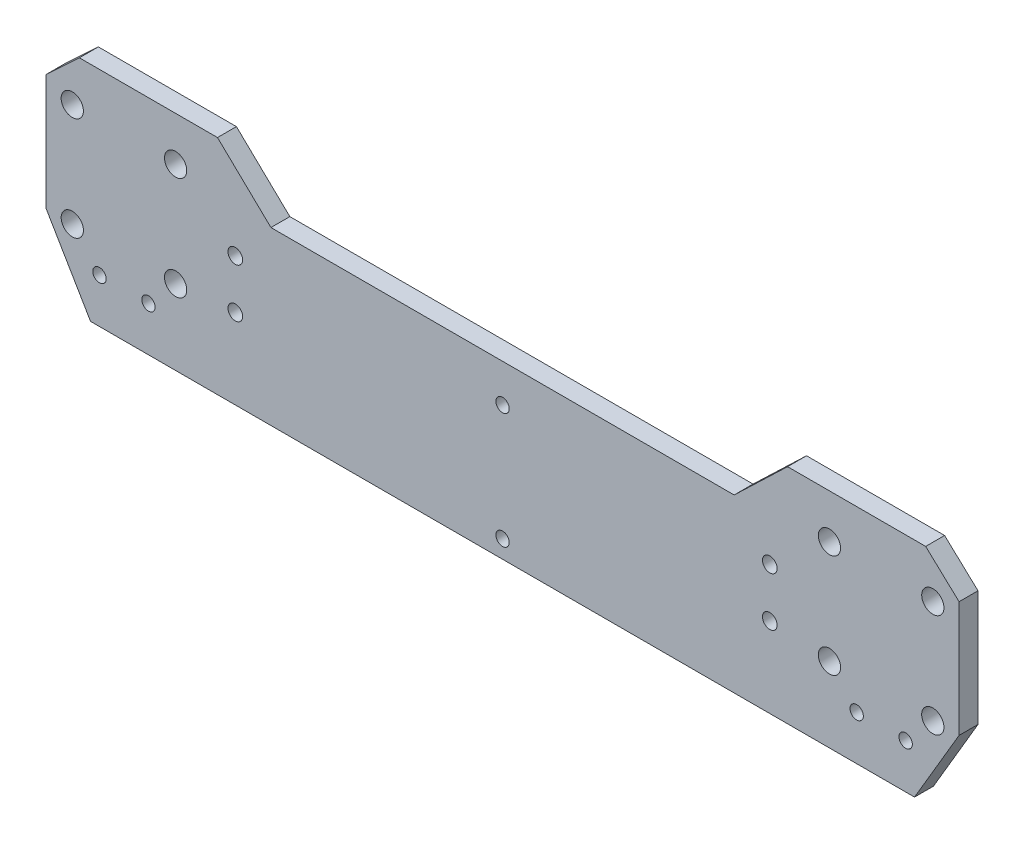
ISO-10303-21;
HEADER;
FILE_DESCRIPTION(('STEP AP214'),'2;1');
FILE_NAME('part.step','',(''),(''),'','','');
FILE_SCHEMA(('AUTOMOTIVE_DESIGN { 1 0 10303 214 1 1 1 1 }'));
ENDSEC;
DATA;
#1=APPLICATION_CONTEXT('core data for automotive mechanical design processes');
#2=APPLICATION_PROTOCOL_DEFINITION('international standard','automotive_design',2000,#1);
#3=PRODUCT_CONTEXT('',#1,'mechanical');
#4=PRODUCT('Part','Part','',(#3));
#5=PRODUCT_RELATED_PRODUCT_CATEGORY('part','',(#4));
#6=PRODUCT_DEFINITION_FORMATION('','',#4);
#7=PRODUCT_DEFINITION_CONTEXT('part definition',#1,'design');
#8=PRODUCT_DEFINITION('design','',#6,#7);
#9=PRODUCT_DEFINITION_SHAPE('','',#8);
#10=(LENGTH_UNIT() NAMED_UNIT(*) SI_UNIT(.MILLI.,.METRE.));
#11=(NAMED_UNIT(*) PLANE_ANGLE_UNIT() SI_UNIT($,.RADIAN.));
#12=(NAMED_UNIT(*) SI_UNIT($,.STERADIAN.) SOLID_ANGLE_UNIT());
#13=UNCERTAINTY_MEASURE_WITH_UNIT(LENGTH_MEASURE(1.E-05),#10,'distance_accuracy_value','');
#14=(GEOMETRIC_REPRESENTATION_CONTEXT(3) GLOBAL_UNCERTAINTY_ASSIGNED_CONTEXT((#13)) GLOBAL_UNIT_ASSIGNED_CONTEXT((#10,
#11,#12)) REPRESENTATION_CONTEXT('',''));
#15=CARTESIAN_POINT('',(0.,0.,0.));
#16=DIRECTION('',(0.,0.,1.));
#17=DIRECTION('',(1.,0.,0.));
#18=AXIS2_PLACEMENT_3D('',#15,#16,#17);
#19=CARTESIAN_POINT('',(0.,0.,4.25));
#20=DIRECTION('',(0.,0.,1.));
#21=DIRECTION('',(1.,0.,0.));
#22=AXIS2_PLACEMENT_3D('',#19,#20,#21);
#23=PLANE('',#22);
#24=CARTESIAN_POINT('',(0.00330952834613573,-20.0074832500386,4.25));
#25=DIRECTION('',(0.,0.,1.));
#26=DIRECTION('',(1.,0.,0.));
#27=AXIS2_PLACEMENT_3D('',#24,#25,#26);
#28=CIRCLE('',#27,1.50001874027195);
#29=CARTESIAN_POINT('',(1.50332826861809,-20.0074832500386,4.25));
#30=VERTEX_POINT('',#29);
#31=EDGE_CURVE('E347',#30,#30,#28,.T.);
#32=ORIENTED_EDGE('',*,*,#31,.F.);
#33=EDGE_LOOP('',(#32));
#34=FACE_BOUND('',#33,.T.);
#35=CARTESIAN_POINT('',(-90.5000193888464,-40.,4.25));
#36=DIRECTION('',(0.,0.,1.));
#37=DIRECTION('',(1.,0.,0.));
#38=AXIS2_PLACEMENT_3D('',#35,#36,#37);
#39=CIRCLE('',#38,1.49997669436749);
#40=CARTESIAN_POINT('',(-89.0000426944789,-40.,4.25));
#41=VERTEX_POINT('',#40);
#42=EDGE_CURVE('E359',#41,#41,#39,.T.);
#43=ORIENTED_EDGE('',*,*,#42,.F.);
#44=EDGE_LOOP('',(#43));
#45=FACE_BOUND('',#44,.T.);
#46=CARTESIAN_POINT('',(-73.3987071931246,-33.1124664238585,4.25));
#47=DIRECTION('',(0.,0.,1.));
#48=DIRECTION('',(1.,0.,0.));
#49=AXIS2_PLACEMENT_3D('',#46,#47,#48);
#50=CIRCLE('',#49,2.49873829135754);
#51=CARTESIAN_POINT('',(-70.8999689017671,-33.1124664238585,4.25));
#52=VERTEX_POINT('',#51);
#53=EDGE_CURVE('E371',#52,#52,#50,.T.);
#54=ORIENTED_EDGE('',*,*,#53,.F.);
#55=EDGE_LOOP('',(#54));
#56=FACE_BOUND('',#55,.T.);
#57=CARTESIAN_POINT('',(-59.99995,-20.9999751749917,4.25));
#58=DIRECTION('',(0.,0.,1.));
#59=DIRECTION('',(1.,0.,0.));
#60=AXIS2_PLACEMENT_3D('',#57,#58,#59);
#61=CIRCLE('',#60,1.65000380400848);
#62=CARTESIAN_POINT('',(-58.3499461959915,-20.9999751749917,4.25));
#63=VERTEX_POINT('',#62);
#64=EDGE_CURVE('E383',#63,#63,#61,.T.);
#65=ORIENTED_EDGE('',*,*,#64,.F.);
#66=EDGE_LOOP('',(#65));
#67=FACE_BOUND('',#66,.T.);
#68=CARTESIAN_POINT('',(60.0066019298635,-31.9998742051955,4.25));
#69=DIRECTION('',(0.,0.,1.));
#70=DIRECTION('',(-1.,0.,0.));
#71=AXIS2_PLACEMENT_3D('',#68,#69,#70);
#72=CIRCLE('',#71,1.64998699004768);
#73=CARTESIAN_POINT('',(58.3566149398158,-31.9998742051955,4.25));
#74=VERTEX_POINT('',#73);
#75=EDGE_CURVE('E395',#74,#74,#72,.T.);
#76=ORIENTED_EDGE('',*,*,#75,.F.);
#77=EDGE_LOOP('',(#76));
#78=FACE_BOUND('',#77,.T.);
#79=CARTESIAN_POINT('',(73.4053621722694,-33.1122652178507,4.25));
#80=DIRECTION('',(0.,0.,1.));
#81=DIRECTION('',(-1.,0.,0.));
#82=AXIS2_PLACEMENT_3D('',#79,#80,#81);
#83=CIRCLE('',#82,2.49873829135753);
#84=CARTESIAN_POINT('',(70.9066238809119,-33.1122652178507,4.25));
#85=VERTEX_POINT('',#84);
#86=EDGE_CURVE('E407',#85,#85,#83,.T.);
#87=ORIENTED_EDGE('',*,*,#86,.F.);
#88=EDGE_LOOP('',(#87));
#89=FACE_BOUND('',#88,.T.);
#90=CARTESIAN_POINT('',(73.4065913502175,-9.89977379053565,4.25));
#91=DIRECTION('',(0.,0.,1.));
#92=DIRECTION('',(-1.,0.,0.));
#93=AXIS2_PLACEMENT_3D('',#90,#91,#92);
#94=CIRCLE('',#93,2.49997137796116);
#95=CARTESIAN_POINT('',(70.9066199722563,-9.89977379053565,4.25));
#96=VERTEX_POINT('',#95);
#97=EDGE_CURVE('E419',#96,#96,#94,.T.);
#98=ORIENTED_EDGE('',*,*,#97,.F.);
#99=EDGE_LOOP('',(#98));
#100=FACE_BOUND('',#99,.T.);
#101=CARTESIAN_POINT('',(96.6037044146789,-33.1130854762066,4.25));
#102=DIRECTION('',(0.,0.,1.));
#103=DIRECTION('',(-1.,0.,0.));
#104=AXIS2_PLACEMENT_3D('',#101,#102,#103);
#105=CIRCLE('',#104,2.49994760386927);
#106=CARTESIAN_POINT('',(94.1037568108097,-33.1130854762066,4.25));
#107=VERTEX_POINT('',#106);
#108=EDGE_CURVE('E431',#107,#107,#105,.T.);
#109=ORIENTED_EDGE('',*,*,#108,.F.);
#110=EDGE_LOOP('',(#109));
#111=FACE_BOUND('',#110,.T.);
#112=CARTESIAN_POINT('',(-96.6000080735269,-9.89999592861705,4.25));
#113=DIRECTION('',(0.,0.,1.));
#114=DIRECTION('',(1.,0.,0.));
#115=AXIS2_PLACEMENT_3D('',#112,#113,#114);
#116=CIRCLE('',#115,2.50000807353394);
#117=CARTESIAN_POINT('',(-94.099999999993,-9.89999592861705,4.25));
#118=VERTEX_POINT('',#117);
#119=EDGE_CURVE('E158',#118,#118,#116,.T.);
#120=ORIENTED_EDGE('',*,*,#119,.F.);
#121=EDGE_LOOP('',(#120));
#122=FACE_BOUND('',#121,.T.);
#123=DIRECTION('',(0.507020126563394,0.861934215157769,0.));
#124=VECTOR('',#123,1.);
#125=CARTESIAN_POINT('',(92.5,-50.,4.25));
#126=LINE('',#125,#124);
#127=CARTESIAN_POINT('',(92.5,-50.,4.25));
#128=VERTEX_POINT('',#127);
#129=CARTESIAN_POINT('',(102.5,-33.,4.25));
#130=VERTEX_POINT('',#129);
#131=EDGE_CURVE('E177',#128,#130,#126,.T.);
#132=ORIENTED_EDGE('',*,*,#131,.T.);
#133=DIRECTION('',(0.,1.,0.));
#134=VECTOR('',#133,1.);
#135=CARTESIAN_POINT('',(102.5,-33.,4.25));
#136=LINE('',#135,#134);
#137=CARTESIAN_POINT('',(102.5,-7.,4.25));
#138=VERTEX_POINT('',#137);
#139=EDGE_CURVE('E105',#130,#138,#136,.T.);
#140=ORIENTED_EDGE('',*,*,#139,.T.);
#141=DIRECTION('',(-0.731055268242869,0.682318250360011,0.));
#142=VECTOR('',#141,1.);
#143=CARTESIAN_POINT('',(102.5,-7.,4.25));
#144=LINE('',#143,#142);
#145=CARTESIAN_POINT('',(95.,0.,4.25));
#146=VERTEX_POINT('',#145);
#147=EDGE_CURVE('E204',#138,#146,#144,.T.);
#148=ORIENTED_EDGE('',*,*,#147,.T.);
#149=DIRECTION('',(-1.,0.,0.));
#150=VECTOR('',#149,1.);
#151=CARTESIAN_POINT('',(95.,0.,4.25));
#152=LINE('',#151,#150);
#153=CARTESIAN_POINT('',(64.,0.,4.25));
#154=VERTEX_POINT('',#153);
#155=EDGE_CURVE('E223',#146,#154,#152,.T.);
#156=ORIENTED_EDGE('',*,*,#155,.T.);
#157=DIRECTION('',(-0.721988205115424,-0.691905363235615,0.));
#158=VECTOR('',#157,1.);
#159=CARTESIAN_POINT('',(64.,0.,4.25));
#160=LINE('',#159,#158);
#161=CARTESIAN_POINT('',(52.,-11.5,4.25));
#162=VERTEX_POINT('',#161);
#163=EDGE_CURVE('E220',#154,#162,#160,.T.);
#164=ORIENTED_EDGE('',*,*,#163,.T.);
#165=DIRECTION('',(-1.,0.,0.));
#166=VECTOR('',#165,1.);
#167=CARTESIAN_POINT('',(52.,-11.5,4.25));
#168=LINE('',#167,#166);
#169=CARTESIAN_POINT('',(-52.,-11.5,4.25));
#170=VERTEX_POINT('',#169);
#171=EDGE_CURVE('E222',#162,#170,#168,.T.);
#172=ORIENTED_EDGE('',*,*,#171,.T.);
#173=DIRECTION('',(-0.721988205115424,0.691905363235615,0.));
#174=VECTOR('',#173,1.);
#175=CARTESIAN_POINT('',(-52.,-11.5,4.25));
#176=LINE('',#175,#174);
#177=CARTESIAN_POINT('',(-64.,0.,4.25));
#178=VERTEX_POINT('',#177);
#179=EDGE_CURVE('E225',#170,#178,#176,.T.);
#180=ORIENTED_EDGE('',*,*,#179,.T.);
#181=DIRECTION('',(-1.,0.,0.));
#182=VECTOR('',#181,1.);
#183=CARTESIAN_POINT('',(-64.,0.,4.25));
#184=LINE('',#183,#182);
#185=CARTESIAN_POINT('',(-95.,0.,4.25));
#186=VERTEX_POINT('',#185);
#187=EDGE_CURVE('E231',#178,#186,#184,.T.);
#188=ORIENTED_EDGE('',*,*,#187,.T.);
#189=DIRECTION('',(-0.731055268242869,-0.682318250360011,0.));
#190=VECTOR('',#189,1.);
#191=CARTESIAN_POINT('',(-95.,0.,4.25));
#192=LINE('',#191,#190);
#193=CARTESIAN_POINT('',(-102.5,-7.,4.25));
#194=VERTEX_POINT('',#193);
#195=EDGE_CURVE('E136',#186,#194,#192,.T.);
#196=ORIENTED_EDGE('',*,*,#195,.T.);
#197=DIRECTION('',(0.,-1.,0.));
#198=VECTOR('',#197,1.);
#199=CARTESIAN_POINT('',(-102.5,-7.,4.25));
#200=LINE('',#199,#198);
#201=CARTESIAN_POINT('',(-102.5,-33.,4.25));
#202=VERTEX_POINT('',#201);
#203=EDGE_CURVE('E130',#194,#202,#200,.T.);
#204=ORIENTED_EDGE('',*,*,#203,.T.);
#205=DIRECTION('',(0.507020126563394,-0.861934215157769,0.));
#206=VECTOR('',#205,1.);
#207=CARTESIAN_POINT('',(-102.5,-33.,4.25));
#208=LINE('',#207,#206);
#209=CARTESIAN_POINT('',(-92.5,-50.,4.25));
#210=VERTEX_POINT('',#209);
#211=EDGE_CURVE('E134',#202,#210,#208,.T.);
#212=ORIENTED_EDGE('',*,*,#211,.T.);
#213=DIRECTION('',(1.,0.,0.));
#214=VECTOR('',#213,1.);
#215=CARTESIAN_POINT('',(-92.5,-50.,4.25));
#216=LINE('',#215,#214);
#217=EDGE_CURVE('E50',#210,#128,#216,.T.);
#218=ORIENTED_EDGE('',*,*,#217,.T.);
#219=EDGE_LOOP('',(#132,#140,#148,#156,#164,#172,#180,#188,#196,#204,#212,#218));
#220=FACE_BOUND('',#219,.T.);
#221=CARTESIAN_POINT('',(96.6065994237146,-9.89973112444412,4.25));
#222=DIRECTION('',(0.,0.,1.));
#223=DIRECTION('',(-1.,0.,0.));
#224=AXIS2_PLACEMENT_3D('',#221,#222,#223);
#225=CIRCLE('',#224,2.50000807353395);
#226=CARTESIAN_POINT('',(94.1065913501806,-9.89973112444412,4.25));
#227=VERTEX_POINT('',#226);
#228=EDGE_CURVE('E437',#227,#227,#225,.T.);
#229=ORIENTED_EDGE('',*,*,#228,.F.);
#230=EDGE_LOOP('',(#229));
#231=FACE_BOUND('',#230,.T.);
#232=CARTESIAN_POINT('',(90.5066932476916,-39.9997519166997,4.25));
#233=DIRECTION('',(0.,0.,1.));
#234=DIRECTION('',(-1.,0.,0.));
#235=AXIS2_PLACEMENT_3D('',#232,#233,#234);
#236=CIRCLE('',#235,1.49997669436749);
#237=CARTESIAN_POINT('',(89.0067165533241,-39.9997519166997,4.25));
#238=VERTEX_POINT('',#237);
#239=EDGE_CURVE('E425',#238,#238,#236,.T.);
#240=ORIENTED_EDGE('',*,*,#239,.F.);
#241=EDGE_LOOP('',(#240));
#242=FACE_BOUND('',#241,.T.);
#243=CARTESIAN_POINT('',(79.5066738588864,-39.9997820694059,4.25));
#244=DIRECTION('',(0.,0.,1.));
#245=DIRECTION('',(-1.,0.,0.));
#246=AXIS2_PLACEMENT_3D('',#243,#244,#245);
#247=CIRCLE('',#246,1.50001782656073);
#248=CARTESIAN_POINT('',(78.0066560323257,-39.9997820694059,4.25));
#249=VERTEX_POINT('',#248);
#250=EDGE_CURVE('E413',#249,#249,#247,.T.);
#251=ORIENTED_EDGE('',*,*,#250,.F.);
#252=EDGE_LOOP('',(#251));
#253=FACE_BOUND('',#252,.T.);
#254=CARTESIAN_POINT('',(60.0065717770364,-20.9998106970364,4.25));
#255=DIRECTION('',(0.,0.,1.));
#256=DIRECTION('',(-1.,0.,0.));
#257=AXIS2_PLACEMENT_3D('',#254,#255,#256);
#258=CIRCLE('',#257,1.65000380400848);
#259=CARTESIAN_POINT('',(58.3565679730279,-20.9998106970364,4.25));
#260=VERTEX_POINT('',#259);
#261=EDGE_CURVE('E401',#260,#260,#258,.T.);
#262=ORIENTED_EDGE('',*,*,#261,.F.);
#263=EDGE_LOOP('',(#262));
#264=FACE_BOUND('',#263,.T.);
#265=CARTESIAN_POINT('',(-73.4,-9.899975,4.25));
#266=DIRECTION('',(0.,0.,1.));
#267=DIRECTION('',(1.,0.,0.));
#268=AXIS2_PLACEMENT_3D('',#265,#266,#267);
#269=CIRCLE('',#268,2.49997137796115);
#270=CARTESIAN_POINT('',(-70.9000286220388,-9.899975,4.25));
#271=VERTEX_POINT('',#270);
#272=EDGE_CURVE('E389',#271,#271,#269,.T.);
#273=ORIENTED_EDGE('',*,*,#272,.F.);
#274=EDGE_LOOP('',(#273));
#275=FACE_BOUND('',#274,.T.);
#276=CARTESIAN_POINT('',(-59.99995,-32.0000386831921,4.25));
#277=DIRECTION('',(0.,0.,1.));
#278=DIRECTION('',(1.,0.,0.));
#279=AXIS2_PLACEMENT_3D('',#276,#277,#278);
#280=CIRCLE('',#279,1.64998699004767);
#281=CARTESIAN_POINT('',(-58.3499630099523,-32.0000386831921,4.25));
#282=VERTEX_POINT('',#281);
#283=EDGE_CURVE('E377',#282,#282,#280,.T.);
#284=ORIENTED_EDGE('',*,*,#283,.F.);
#285=EDGE_LOOP('',(#284));
#286=FACE_BOUND('',#285,.T.);
#287=CARTESIAN_POINT('',(-96.5970494331985,-33.1133502723566,4.25));
#288=DIRECTION('',(0.,0.,1.));
#289=DIRECTION('',(1.,0.,0.));
#290=AXIS2_PLACEMENT_3D('',#287,#288,#289);
#291=CIRCLE('',#290,2.49994760386927);
#292=CARTESIAN_POINT('',(-94.0971018293293,-33.1133502723566,4.25));
#293=VERTEX_POINT('',#292);
#294=EDGE_CURVE('E365',#293,#293,#291,.T.);
#295=ORIENTED_EDGE('',*,*,#294,.F.);
#296=EDGE_LOOP('',(#295));
#297=FACE_BOUND('',#296,.T.);
#298=CARTESIAN_POINT('',(-79.5,-40.,4.25));
#299=DIRECTION('',(0.,0.,1.));
#300=DIRECTION('',(1.,0.,0.));
#301=AXIS2_PLACEMENT_3D('',#298,#299,#300);
#302=CIRCLE('',#301,1.50001782656073);
#303=CARTESIAN_POINT('',(-77.9999821734393,-40.,4.25));
#304=VERTEX_POINT('',#303);
#305=EDGE_CURVE('E353',#304,#304,#302,.T.);
#306=ORIENTED_EDGE('',*,*,#305,.F.);
#307=EDGE_LOOP('',(#306));
#308=FACE_BOUND('',#307,.T.);
#309=CARTESIAN_POINT('',(0.00334516333782881,-46.0075110335172,4.25));
#310=DIRECTION('',(0.,0.,1.));
#311=DIRECTION('',(1.,0.,0.));
#312=AXIS2_PLACEMENT_3D('',#309,#310,#311);
#313=CIRCLE('',#312,1.49998966157518);
#314=CARTESIAN_POINT('',(1.50333482491301,-46.0075110335172,4.25));
#315=VERTEX_POINT('',#314);
#316=EDGE_CURVE('E338',#315,#315,#313,.T.);
#317=ORIENTED_EDGE('',*,*,#316,.F.);
#318=EDGE_LOOP('',(#317));
#319=FACE_BOUND('',#318,.T.);
#320=ADVANCED_FACE('F33',(#34,#45,#56,#67,#78,#89,#100,#111,#122,#220,#231,#242,#253,#264,#275,
#286,#297,#308,#319),#23,.T.);
#321=CARTESIAN_POINT('',(0.,0.,0.));
#322=DIRECTION('',(0.,0.,1.));
#323=DIRECTION('',(1.,0.,0.));
#324=AXIS2_PLACEMENT_3D('',#321,#322,#323);
#325=PLANE('',#324);
#326=DIRECTION('',(0.507020126563394,0.861934215157769,0.));
#327=VECTOR('',#326,1.);
#328=CARTESIAN_POINT('',(92.5,-50.,0.));
#329=LINE('',#328,#327);
#330=CARTESIAN_POINT('',(92.5,-50.,0.));
#331=VERTEX_POINT('',#330);
#332=CARTESIAN_POINT('',(102.5,-33.,0.));
#333=VERTEX_POINT('',#332);
#334=EDGE_CURVE('E154',#331,#333,#329,.T.);
#335=ORIENTED_EDGE('',*,*,#334,.F.);
#336=DIRECTION('',(1.,0.,0.));
#337=VECTOR('',#336,1.);
#338=CARTESIAN_POINT('',(-92.5,-50.,0.));
#339=LINE('',#338,#337);
#340=CARTESIAN_POINT('',(-92.5,-50.,0.));
#341=VERTEX_POINT('',#340);
#342=EDGE_CURVE('E97',#341,#331,#339,.T.);
#343=ORIENTED_EDGE('',*,*,#342,.F.);
#344=DIRECTION('',(0.507020126563394,-0.861934215157769,0.));
#345=VECTOR('',#344,1.);
#346=CARTESIAN_POINT('',(-102.5,-33.,0.));
#347=LINE('',#346,#345);
#348=CARTESIAN_POINT('',(-102.5,-33.,0.));
#349=VERTEX_POINT('',#348);
#350=EDGE_CURVE('E91',#349,#341,#347,.T.);
#351=ORIENTED_EDGE('',*,*,#350,.F.);
#352=DIRECTION('',(0.,-1.,0.));
#353=VECTOR('',#352,1.);
#354=CARTESIAN_POINT('',(-102.5,-7.,0.));
#355=LINE('',#354,#353);
#356=CARTESIAN_POINT('',(-102.5,-7.,0.));
#357=VERTEX_POINT('',#356);
#358=EDGE_CURVE('E144',#357,#349,#355,.T.);
#359=ORIENTED_EDGE('',*,*,#358,.F.);
#360=DIRECTION('',(-0.731055268242869,-0.682318250360011,0.));
#361=VECTOR('',#360,1.);
#362=CARTESIAN_POINT('',(-95.,0.,0.));
#363=LINE('',#362,#361);
#364=CARTESIAN_POINT('',(-95.,0.,0.));
#365=VERTEX_POINT('',#364);
#366=EDGE_CURVE('E172',#365,#357,#363,.T.);
#367=ORIENTED_EDGE('',*,*,#366,.F.);
#368=DIRECTION('',(-1.,0.,0.));
#369=VECTOR('',#368,1.);
#370=CARTESIAN_POINT('',(-64.,0.,0.));
#371=LINE('',#370,#369);
#372=CARTESIAN_POINT('',(-64.,0.,0.));
#373=VERTEX_POINT('',#372);
#374=EDGE_CURVE('E170',#373,#365,#371,.T.);
#375=ORIENTED_EDGE('',*,*,#374,.F.);
#376=DIRECTION('',(-0.721988205115424,0.691905363235615,0.));
#377=VECTOR('',#376,1.);
#378=CARTESIAN_POINT('',(-52.,-11.5,0.));
#379=LINE('',#378,#377);
#380=CARTESIAN_POINT('',(-52.,-11.5,0.));
#381=VERTEX_POINT('',#380);
#382=EDGE_CURVE('E168',#381,#373,#379,.T.);
#383=ORIENTED_EDGE('',*,*,#382,.F.);
#384=DIRECTION('',(-1.,0.,0.));
#385=VECTOR('',#384,1.);
#386=CARTESIAN_POINT('',(52.,-11.5,0.));
#387=LINE('',#386,#385);
#388=CARTESIAN_POINT('',(52.,-11.5,0.));
#389=VERTEX_POINT('',#388);
#390=EDGE_CURVE('E166',#389,#381,#387,.T.);
#391=ORIENTED_EDGE('',*,*,#390,.F.);
#392=DIRECTION('',(-0.721988205115424,-0.691905363235615,0.));
#393=VECTOR('',#392,1.);
#394=CARTESIAN_POINT('',(64.,0.,0.));
#395=LINE('',#394,#393);
#396=CARTESIAN_POINT('',(64.,0.,0.));
#397=VERTEX_POINT('',#396);
#398=EDGE_CURVE('E164',#397,#389,#395,.T.);
#399=ORIENTED_EDGE('',*,*,#398,.F.);
#400=DIRECTION('',(-1.,0.,0.));
#401=VECTOR('',#400,1.);
#402=CARTESIAN_POINT('',(95.,0.,0.));
#403=LINE('',#402,#401);
#404=CARTESIAN_POINT('',(95.,0.,0.));
#405=VERTEX_POINT('',#404);
#406=EDGE_CURVE('E162',#405,#397,#403,.T.);
#407=ORIENTED_EDGE('',*,*,#406,.F.);
#408=DIRECTION('',(-0.731055268242869,0.682318250360011,0.));
#409=VECTOR('',#408,1.);
#410=CARTESIAN_POINT('',(102.5,-7.,0.));
#411=LINE('',#410,#409);
#412=CARTESIAN_POINT('',(102.5,-7.,0.));
#413=VERTEX_POINT('',#412);
#414=EDGE_CURVE('E160',#413,#405,#411,.T.);
#415=ORIENTED_EDGE('',*,*,#414,.F.);
#416=DIRECTION('',(0.,1.,0.));
#417=VECTOR('',#416,1.);
#418=CARTESIAN_POINT('',(102.5,-33.,0.));
#419=LINE('',#418,#417);
#420=EDGE_CURVE('E157',#333,#413,#419,.T.);
#421=ORIENTED_EDGE('',*,*,#420,.F.);
#422=EDGE_LOOP('',(#335,#343,#351,#359,#367,#375,#383,#391,#399,#407,#415,#421));
#423=FACE_BOUND('',#422,.T.);
#424=CARTESIAN_POINT('',(-96.6000080735269,-9.89999592861705,0.));
#425=DIRECTION('',(0.,0.,1.));
#426=DIRECTION('',(1.,0.,0.));
#427=AXIS2_PLACEMENT_3D('',#424,#425,#426);
#428=CIRCLE('',#427,2.50000807353394);
#429=CARTESIAN_POINT('',(-94.099999999993,-9.89999592861705,0.));
#430=VERTEX_POINT('',#429);
#431=EDGE_CURVE('E440',#430,#430,#428,.T.);
#432=ORIENTED_EDGE('',*,*,#431,.T.);
#433=EDGE_LOOP('',(#432));
#434=FACE_BOUND('',#433,.T.);
#435=CARTESIAN_POINT('',(96.6065994237146,-9.89973112444412,0.));
#436=DIRECTION('',(0.,0.,1.));
#437=DIRECTION('',(-1.,0.,0.));
#438=AXIS2_PLACEMENT_3D('',#435,#436,#437);
#439=CIRCLE('',#438,2.50000807353395);
#440=CARTESIAN_POINT('',(94.1065913501806,-9.89973112444412,0.));
#441=VERTEX_POINT('',#440);
#442=EDGE_CURVE('E434',#441,#441,#439,.T.);
#443=ORIENTED_EDGE('',*,*,#442,.T.);
#444=EDGE_LOOP('',(#443));
#445=FACE_BOUND('',#444,.T.);
#446=CARTESIAN_POINT('',(96.6037044146789,-33.1130854762066,0.));
#447=DIRECTION('',(0.,0.,1.));
#448=DIRECTION('',(-1.,0.,0.));
#449=AXIS2_PLACEMENT_3D('',#446,#447,#448);
#450=CIRCLE('',#449,2.49994760386927);
#451=CARTESIAN_POINT('',(94.1037568108097,-33.1130854762066,0.));
#452=VERTEX_POINT('',#451);
#453=EDGE_CURVE('E428',#452,#452,#450,.T.);
#454=ORIENTED_EDGE('',*,*,#453,.T.);
#455=EDGE_LOOP('',(#454));
#456=FACE_BOUND('',#455,.T.);
#457=CARTESIAN_POINT('',(90.5066932476916,-39.9997519166997,0.));
#458=DIRECTION('',(0.,0.,1.));
#459=DIRECTION('',(-1.,0.,0.));
#460=AXIS2_PLACEMENT_3D('',#457,#458,#459);
#461=CIRCLE('',#460,1.49997669436749);
#462=CARTESIAN_POINT('',(89.0067165533241,-39.9997519166997,0.));
#463=VERTEX_POINT('',#462);
#464=EDGE_CURVE('E422',#463,#463,#461,.T.);
#465=ORIENTED_EDGE('',*,*,#464,.T.);
#466=EDGE_LOOP('',(#465));
#467=FACE_BOUND('',#466,.T.);
#468=CARTESIAN_POINT('',(73.4065913502175,-9.89977379053565,0.));
#469=DIRECTION('',(0.,0.,1.));
#470=DIRECTION('',(-1.,0.,0.));
#471=AXIS2_PLACEMENT_3D('',#468,#469,#470);
#472=CIRCLE('',#471,2.49997137796116);
#473=CARTESIAN_POINT('',(70.9066199722563,-9.89977379053565,0.));
#474=VERTEX_POINT('',#473);
#475=EDGE_CURVE('E416',#474,#474,#472,.T.);
#476=ORIENTED_EDGE('',*,*,#475,.T.);
#477=EDGE_LOOP('',(#476));
#478=FACE_BOUND('',#477,.T.);
#479=CARTESIAN_POINT('',(79.5066738588864,-39.9997820694059,0.));
#480=DIRECTION('',(0.,0.,1.));
#481=DIRECTION('',(-1.,0.,0.));
#482=AXIS2_PLACEMENT_3D('',#479,#480,#481);
#483=CIRCLE('',#482,1.50001782656073);
#484=CARTESIAN_POINT('',(78.0066560323257,-39.9997820694059,0.));
#485=VERTEX_POINT('',#484);
#486=EDGE_CURVE('E410',#485,#485,#483,.T.);
#487=ORIENTED_EDGE('',*,*,#486,.T.);
#488=EDGE_LOOP('',(#487));
#489=FACE_BOUND('',#488,.T.);
#490=CARTESIAN_POINT('',(73.4053621722694,-33.1122652178507,0.));
#491=DIRECTION('',(0.,0.,1.));
#492=DIRECTION('',(-1.,0.,0.));
#493=AXIS2_PLACEMENT_3D('',#490,#491,#492);
#494=CIRCLE('',#493,2.49873829135753);
#495=CARTESIAN_POINT('',(70.9066238809119,-33.1122652178507,0.));
#496=VERTEX_POINT('',#495);
#497=EDGE_CURVE('E404',#496,#496,#494,.T.);
#498=ORIENTED_EDGE('',*,*,#497,.T.);
#499=EDGE_LOOP('',(#498));
#500=FACE_BOUND('',#499,.T.);
#501=CARTESIAN_POINT('',(60.0065717770364,-20.9998106970364,0.));
#502=DIRECTION('',(0.,0.,1.));
#503=DIRECTION('',(-1.,0.,0.));
#504=AXIS2_PLACEMENT_3D('',#501,#502,#503);
#505=CIRCLE('',#504,1.65000380400848);
#506=CARTESIAN_POINT('',(58.3565679730279,-20.9998106970364,0.));
#507=VERTEX_POINT('',#506);
#508=EDGE_CURVE('E398',#507,#507,#505,.T.);
#509=ORIENTED_EDGE('',*,*,#508,.T.);
#510=EDGE_LOOP('',(#509));
#511=FACE_BOUND('',#510,.T.);
#512=CARTESIAN_POINT('',(60.0066019298635,-31.9998742051955,0.));
#513=DIRECTION('',(0.,0.,1.));
#514=DIRECTION('',(-1.,0.,0.));
#515=AXIS2_PLACEMENT_3D('',#512,#513,#514);
#516=CIRCLE('',#515,1.64998699004768);
#517=CARTESIAN_POINT('',(58.3566149398158,-31.9998742051955,0.));
#518=VERTEX_POINT('',#517);
#519=EDGE_CURVE('E392',#518,#518,#516,.T.);
#520=ORIENTED_EDGE('',*,*,#519,.T.);
#521=EDGE_LOOP('',(#520));
#522=FACE_BOUND('',#521,.T.);
#523=CARTESIAN_POINT('',(-73.4,-9.899975,0.));
#524=DIRECTION('',(0.,0.,1.));
#525=DIRECTION('',(1.,0.,0.));
#526=AXIS2_PLACEMENT_3D('',#523,#524,#525);
#527=CIRCLE('',#526,2.49997137796115);
#528=CARTESIAN_POINT('',(-70.9000286220388,-9.899975,0.));
#529=VERTEX_POINT('',#528);
#530=EDGE_CURVE('E386',#529,#529,#527,.T.);
#531=ORIENTED_EDGE('',*,*,#530,.T.);
#532=EDGE_LOOP('',(#531));
#533=FACE_BOUND('',#532,.T.);
#534=CARTESIAN_POINT('',(-59.99995,-20.9999751749917,0.));
#535=DIRECTION('',(0.,0.,1.));
#536=DIRECTION('',(1.,0.,0.));
#537=AXIS2_PLACEMENT_3D('',#534,#535,#536);
#538=CIRCLE('',#537,1.65000380400848);
#539=CARTESIAN_POINT('',(-58.3499461959915,-20.9999751749917,0.));
#540=VERTEX_POINT('',#539);
#541=EDGE_CURVE('E380',#540,#540,#538,.T.);
#542=ORIENTED_EDGE('',*,*,#541,.T.);
#543=EDGE_LOOP('',(#542));
#544=FACE_BOUND('',#543,.T.);
#545=CARTESIAN_POINT('',(-59.99995,-32.0000386831921,0.));
#546=DIRECTION('',(0.,0.,1.));
#547=DIRECTION('',(1.,0.,0.));
#548=AXIS2_PLACEMENT_3D('',#545,#546,#547);
#549=CIRCLE('',#548,1.64998699004767);
#550=CARTESIAN_POINT('',(-58.3499630099523,-32.0000386831921,0.));
#551=VERTEX_POINT('',#550);
#552=EDGE_CURVE('E374',#551,#551,#549,.T.);
#553=ORIENTED_EDGE('',*,*,#552,.T.);
#554=EDGE_LOOP('',(#553));
#555=FACE_BOUND('',#554,.T.);
#556=CARTESIAN_POINT('',(-73.3987071931246,-33.1124664238585,0.));
#557=DIRECTION('',(0.,0.,1.));
#558=DIRECTION('',(1.,0.,0.));
#559=AXIS2_PLACEMENT_3D('',#556,#557,#558);
#560=CIRCLE('',#559,2.49873829135754);
#561=CARTESIAN_POINT('',(-70.8999689017671,-33.1124664238585,0.));
#562=VERTEX_POINT('',#561);
#563=EDGE_CURVE('E368',#562,#562,#560,.T.);
#564=ORIENTED_EDGE('',*,*,#563,.T.);
#565=EDGE_LOOP('',(#564));
#566=FACE_BOUND('',#565,.T.);
#567=CARTESIAN_POINT('',(-96.5970494331985,-33.1133502723566,0.));
#568=DIRECTION('',(0.,0.,1.));
#569=DIRECTION('',(1.,0.,0.));
#570=AXIS2_PLACEMENT_3D('',#567,#568,#569);
#571=CIRCLE('',#570,2.49994760386927);
#572=CARTESIAN_POINT('',(-94.0971018293293,-33.1133502723566,0.));
#573=VERTEX_POINT('',#572);
#574=EDGE_CURVE('E362',#573,#573,#571,.T.);
#575=ORIENTED_EDGE('',*,*,#574,.T.);
#576=EDGE_LOOP('',(#575));
#577=FACE_BOUND('',#576,.T.);
#578=CARTESIAN_POINT('',(-90.5000193888464,-40.,0.));
#579=DIRECTION('',(0.,0.,1.));
#580=DIRECTION('',(1.,0.,0.));
#581=AXIS2_PLACEMENT_3D('',#578,#579,#580);
#582=CIRCLE('',#581,1.49997669436749);
#583=CARTESIAN_POINT('',(-89.0000426944789,-40.,0.));
#584=VERTEX_POINT('',#583);
#585=EDGE_CURVE('E356',#584,#584,#582,.T.);
#586=ORIENTED_EDGE('',*,*,#585,.T.);
#587=EDGE_LOOP('',(#586));
#588=FACE_BOUND('',#587,.T.);
#589=CARTESIAN_POINT('',(-79.5,-40.,0.));
#590=DIRECTION('',(0.,0.,1.));
#591=DIRECTION('',(1.,0.,0.));
#592=AXIS2_PLACEMENT_3D('',#589,#590,#591);
#593=CIRCLE('',#592,1.50001782656073);
#594=CARTESIAN_POINT('',(-77.9999821734393,-40.,0.));
#595=VERTEX_POINT('',#594);
#596=EDGE_CURVE('E350',#595,#595,#593,.T.);
#597=ORIENTED_EDGE('',*,*,#596,.T.);
#598=EDGE_LOOP('',(#597));
#599=FACE_BOUND('',#598,.T.);
#600=CARTESIAN_POINT('',(0.00330952834613573,-20.0074832500386,0.));
#601=DIRECTION('',(0.,0.,1.));
#602=DIRECTION('',(1.,0.,0.));
#603=AXIS2_PLACEMENT_3D('',#600,#601,#602);
#604=CIRCLE('',#603,1.50001874027195);
#605=CARTESIAN_POINT('',(1.50332826861809,-20.0074832500386,0.));
#606=VERTEX_POINT('',#605);
#607=EDGE_CURVE('E344',#606,#606,#604,.T.);
#608=ORIENTED_EDGE('',*,*,#607,.T.);
#609=EDGE_LOOP('',(#608));
#610=FACE_BOUND('',#609,.T.);
#611=CARTESIAN_POINT('',(0.00334516333782881,-46.0075110335172,0.));
#612=DIRECTION('',(0.,0.,1.));
#613=DIRECTION('',(1.,0.,0.));
#614=AXIS2_PLACEMENT_3D('',#611,#612,#613);
#615=CIRCLE('',#614,1.49998966157518);
#616=CARTESIAN_POINT('',(1.50333482491301,-46.0075110335172,0.));
#617=VERTEX_POINT('',#616);
#618=EDGE_CURVE('E341',#617,#617,#615,.T.);
#619=ORIENTED_EDGE('',*,*,#618,.T.);
#620=EDGE_LOOP('',(#619));
#621=FACE_BOUND('',#620,.T.);
#622=ADVANCED_FACE('F208',(#423,#434,#445,#456,#467,#478,#489,#500,#511,#522,#533,#544,#555,
#566,#577,#588,#599,#610,#621),#325,.F.);
#623=CARTESIAN_POINT('',(92.5,-50.,4.25));
#624=DIRECTION('',(-0.861934215157769,0.507020126563394,0.));
#625=DIRECTION('',(-0.507020126563394,-0.861934215157769,0.));
#626=AXIS2_PLACEMENT_3D('',#623,#624,#625);
#627=PLANE('',#626);
#628=ORIENTED_EDGE('',*,*,#334,.T.);
#629=DIRECTION('',(0.,0.,-1.));
#630=VECTOR('',#629,1.);
#631=CARTESIAN_POINT('',(102.5,-33.,4.25));
#632=LINE('',#631,#630);
#633=EDGE_CURVE('E11',#130,#333,#632,.T.);
#634=ORIENTED_EDGE('',*,*,#633,.F.);
#635=ORIENTED_EDGE('',*,*,#131,.F.);
#636=DIRECTION('',(0.,0.,-1.));
#637=VECTOR('',#636,1.);
#638=CARTESIAN_POINT('',(92.5,-50.,4.25));
#639=LINE('',#638,#637);
#640=EDGE_CURVE('E150',#128,#331,#639,.T.);
#641=ORIENTED_EDGE('',*,*,#640,.T.);
#642=EDGE_LOOP('',(#628,#634,#635,#641));
#643=FACE_BOUND('',#642,.T.);
#644=ADVANCED_FACE('F35',(#643),#627,.F.);
#645=CARTESIAN_POINT('',(102.5,-33.,4.25));
#646=DIRECTION('',(-1.,0.,0.));
#647=DIRECTION('',(0.,0.,1.));
#648=AXIS2_PLACEMENT_3D('',#645,#646,#647);
#649=PLANE('',#648);
#650=ORIENTED_EDGE('',*,*,#420,.T.);
#651=DIRECTION('',(0.,0.,-1.));
#652=VECTOR('',#651,1.);
#653=CARTESIAN_POINT('',(102.5,-7.,4.25));
#654=LINE('',#653,#652);
#655=EDGE_CURVE('E42',#138,#413,#654,.T.);
#656=ORIENTED_EDGE('',*,*,#655,.F.);
#657=ORIENTED_EDGE('',*,*,#139,.F.);
#658=ORIENTED_EDGE('',*,*,#633,.T.);
#659=EDGE_LOOP('',(#650,#656,#657,#658));
#660=FACE_BOUND('',#659,.T.);
#661=ADVANCED_FACE('F676',(#660),#649,.F.);
#662=CARTESIAN_POINT('',(102.5,-7.,4.25));
#663=DIRECTION('',(-0.682318250360011,-0.731055268242869,0.));
#664=DIRECTION('',(0.731055268242869,-0.682318250360011,0.));
#665=AXIS2_PLACEMENT_3D('',#662,#663,#664);
#666=PLANE('',#665);
#667=ORIENTED_EDGE('',*,*,#414,.T.);
#668=DIRECTION('',(0.,0.,-1.));
#669=VECTOR('',#668,1.);
#670=CARTESIAN_POINT('',(95.,0.,4.25));
#671=LINE('',#670,#669);
#672=EDGE_CURVE('E196',#146,#405,#671,.T.);
#673=ORIENTED_EDGE('',*,*,#672,.F.);
#674=ORIENTED_EDGE('',*,*,#147,.F.);
#675=ORIENTED_EDGE('',*,*,#655,.T.);
#676=EDGE_LOOP('',(#667,#673,#674,#675));
#677=FACE_BOUND('',#676,.T.);
#678=ADVANCED_FACE('F202',(#677),#666,.F.);
#679=CARTESIAN_POINT('',(95.,0.,4.25));
#680=DIRECTION('',(0.,-1.,0.));
#681=DIRECTION('',(0.,0.,-1.));
#682=AXIS2_PLACEMENT_3D('',#679,#680,#681);
#683=PLANE('',#682);
#684=ORIENTED_EDGE('',*,*,#406,.T.);
#685=DIRECTION('',(0.,0.,-1.));
#686=VECTOR('',#685,1.);
#687=CARTESIAN_POINT('',(64.,0.,4.25));
#688=LINE('',#687,#686);
#689=EDGE_CURVE('E193',#154,#397,#688,.T.);
#690=ORIENTED_EDGE('',*,*,#689,.F.);
#691=ORIENTED_EDGE('',*,*,#155,.F.);
#692=ORIENTED_EDGE('',*,*,#672,.T.);
#693=EDGE_LOOP('',(#684,#690,#691,#692));
#694=FACE_BOUND('',#693,.T.);
#695=ADVANCED_FACE('F214',(#694),#683,.F.);
#696=CARTESIAN_POINT('',(64.,0.,4.25));
#697=DIRECTION('',(0.691905363235615,-0.721988205115424,0.));
#698=DIRECTION('',(0.721988205115424,0.691905363235615,0.));
#699=AXIS2_PLACEMENT_3D('',#696,#697,#698);
#700=PLANE('',#699);
#701=ORIENTED_EDGE('',*,*,#398,.T.);
#702=DIRECTION('',(0.,0.,-1.));
#703=VECTOR('',#702,1.);
#704=CARTESIAN_POINT('',(52.,-11.5,4.25));
#705=LINE('',#704,#703);
#706=EDGE_CURVE('E190',#162,#389,#705,.T.);
#707=ORIENTED_EDGE('',*,*,#706,.F.);
#708=ORIENTED_EDGE('',*,*,#163,.F.);
#709=ORIENTED_EDGE('',*,*,#689,.T.);
#710=EDGE_LOOP('',(#701,#707,#708,#709));
#711=FACE_BOUND('',#710,.T.);
#712=ADVANCED_FACE('F218',(#711),#700,.F.);
#713=CARTESIAN_POINT('',(52.,-11.5,4.25));
#714=DIRECTION('',(0.,-1.,0.));
#715=DIRECTION('',(0.,0.,-1.));
#716=AXIS2_PLACEMENT_3D('',#713,#714,#715);
#717=PLANE('',#716);
#718=ORIENTED_EDGE('',*,*,#390,.T.);
#719=DIRECTION('',(0.,0.,-1.));
#720=VECTOR('',#719,1.);
#721=CARTESIAN_POINT('',(-52.,-11.5,4.25));
#722=LINE('',#721,#720);
#723=EDGE_CURVE('E187',#170,#381,#722,.T.);
#724=ORIENTED_EDGE('',*,*,#723,.F.);
#725=ORIENTED_EDGE('',*,*,#171,.F.);
#726=ORIENTED_EDGE('',*,*,#706,.T.);
#727=EDGE_LOOP('',(#718,#724,#725,#726));
#728=FACE_BOUND('',#727,.T.);
#729=ADVANCED_FACE('F641',(#728),#717,.F.);
#730=CARTESIAN_POINT('',(-52.,-11.5,4.25));
#731=DIRECTION('',(-0.691905363235615,-0.721988205115424,0.));
#732=DIRECTION('',(0.721988205115424,-0.691905363235615,0.));
#733=AXIS2_PLACEMENT_3D('',#730,#731,#732);
#734=PLANE('',#733);
#735=ORIENTED_EDGE('',*,*,#382,.T.);
#736=DIRECTION('',(0.,0.,-1.));
#737=VECTOR('',#736,1.);
#738=CARTESIAN_POINT('',(-64.,0.,4.25));
#739=LINE('',#738,#737);
#740=EDGE_CURVE('E184',#178,#373,#739,.T.);
#741=ORIENTED_EDGE('',*,*,#740,.F.);
#742=ORIENTED_EDGE('',*,*,#179,.F.);
#743=ORIENTED_EDGE('',*,*,#723,.T.);
#744=EDGE_LOOP('',(#735,#741,#742,#743));
#745=FACE_BOUND('',#744,.T.);
#746=ADVANCED_FACE('F632',(#745),#734,.F.);
#747=CARTESIAN_POINT('',(-64.,0.,4.25));
#748=DIRECTION('',(0.,-1.,0.));
#749=DIRECTION('',(0.,0.,-1.));
#750=AXIS2_PLACEMENT_3D('',#747,#748,#749);
#751=PLANE('',#750);
#752=ORIENTED_EDGE('',*,*,#374,.T.);
#753=DIRECTION('',(0.,0.,-1.));
#754=VECTOR('',#753,1.);
#755=CARTESIAN_POINT('',(-95.,0.,4.25));
#756=LINE('',#755,#754);
#757=EDGE_CURVE('E181',#186,#365,#756,.T.);
#758=ORIENTED_EDGE('',*,*,#757,.F.);
#759=ORIENTED_EDGE('',*,*,#187,.F.);
#760=ORIENTED_EDGE('',*,*,#740,.T.);
#761=EDGE_LOOP('',(#752,#758,#759,#760));
#762=FACE_BOUND('',#761,.T.);
#763=ADVANCED_FACE('F237',(#762),#751,.F.);
#764=CARTESIAN_POINT('',(-95.,0.,4.25));
#765=DIRECTION('',(0.682318250360011,-0.731055268242869,0.));
#766=DIRECTION('',(0.731055268242869,0.682318250360011,0.));
#767=AXIS2_PLACEMENT_3D('',#764,#765,#766);
#768=PLANE('',#767);
#769=ORIENTED_EDGE('',*,*,#366,.T.);
#770=DIRECTION('',(0.,0.,-1.));
#771=VECTOR('',#770,1.);
#772=CARTESIAN_POINT('',(-102.5,-7.,4.25));
#773=LINE('',#772,#771);
#774=EDGE_CURVE('E145',#194,#357,#773,.T.);
#775=ORIENTED_EDGE('',*,*,#774,.F.);
#776=ORIENTED_EDGE('',*,*,#195,.F.);
#777=ORIENTED_EDGE('',*,*,#757,.T.);
#778=EDGE_LOOP('',(#769,#775,#776,#777));
#779=FACE_BOUND('',#778,.T.);
#780=ADVANCED_FACE('F241',(#779),#768,.F.);
#781=CARTESIAN_POINT('',(-102.5,-7.,4.25));
#782=DIRECTION('',(1.,0.,0.));
#783=DIRECTION('',(0.,0.,-1.));
#784=AXIS2_PLACEMENT_3D('',#781,#782,#783);
#785=PLANE('',#784);
#786=ORIENTED_EDGE('',*,*,#358,.T.);
#787=DIRECTION('',(0.,0.,-1.));
#788=VECTOR('',#787,1.);
#789=CARTESIAN_POINT('',(-102.5,-33.,4.25));
#790=LINE('',#789,#788);
#791=EDGE_CURVE('E141',#202,#349,#790,.T.);
#792=ORIENTED_EDGE('',*,*,#791,.F.);
#793=ORIENTED_EDGE('',*,*,#203,.F.);
#794=ORIENTED_EDGE('',*,*,#774,.T.);
#795=EDGE_LOOP('',(#786,#792,#793,#794));
#796=FACE_BOUND('',#795,.T.);
#797=ADVANCED_FACE('F142',(#796),#785,.F.);
#798=CARTESIAN_POINT('',(-102.5,-33.,4.25));
#799=DIRECTION('',(0.861934215157769,0.507020126563394,0.));
#800=DIRECTION('',(-0.507020126563394,0.861934215157769,0.));
#801=AXIS2_PLACEMENT_3D('',#798,#799,#800);
#802=PLANE('',#801);
#803=ORIENTED_EDGE('',*,*,#350,.T.);
#804=DIRECTION('',(0.,0.,-1.));
#805=VECTOR('',#804,1.);
#806=CARTESIAN_POINT('',(-92.5,-50.,4.25));
#807=LINE('',#806,#805);
#808=EDGE_CURVE('E146',#210,#341,#807,.T.);
#809=ORIENTED_EDGE('',*,*,#808,.F.);
#810=ORIENTED_EDGE('',*,*,#211,.F.);
#811=ORIENTED_EDGE('',*,*,#791,.T.);
#812=EDGE_LOOP('',(#803,#809,#810,#811));
#813=FACE_BOUND('',#812,.T.);
#814=ADVANCED_FACE('F148',(#813),#802,.F.);
#815=CARTESIAN_POINT('',(-92.5,-50.,4.25));
#816=DIRECTION('',(0.,1.,0.));
#817=DIRECTION('',(0.,0.,1.));
#818=AXIS2_PLACEMENT_3D('',#815,#816,#817);
#819=PLANE('',#818);
#820=ORIENTED_EDGE('',*,*,#342,.T.);
#821=ORIENTED_EDGE('',*,*,#640,.F.);
#822=ORIENTED_EDGE('',*,*,#217,.F.);
#823=ORIENTED_EDGE('',*,*,#808,.T.);
#824=EDGE_LOOP('',(#820,#821,#822,#823));
#825=FACE_BOUND('',#824,.T.);
#826=ADVANCED_FACE('F245',(#825),#819,.F.);
#827=CARTESIAN_POINT('',(-96.6000080735269,-9.89999592861705,4.25));
#828=DIRECTION('',(0.,0.,-1.));
#829=DIRECTION('',(-1.,0.,0.));
#830=AXIS2_PLACEMENT_3D('',#827,#828,#829);
#831=CYLINDRICAL_SURFACE('',#830,2.50000807353394);
#832=ORIENTED_EDGE('',*,*,#119,.T.);
#833=EDGE_LOOP('',(#832));
#834=FACE_BOUND('',#833,.T.);
#835=ORIENTED_EDGE('',*,*,#431,.F.);
#836=EDGE_LOOP('',(#835));
#837=FACE_BOUND('',#836,.T.);
#838=ADVANCED_FACE('F247',(#834,#837),#831,.F.);
#839=CARTESIAN_POINT('',(96.6065994237146,-9.89973112444412,4.25));
#840=DIRECTION('',(0.,0.,-1.));
#841=DIRECTION('',(-1.,0.,0.));
#842=AXIS2_PLACEMENT_3D('',#839,#840,#841);
#843=CYLINDRICAL_SURFACE('',#842,2.50000807353395);
#844=ORIENTED_EDGE('',*,*,#228,.T.);
#845=EDGE_LOOP('',(#844));
#846=FACE_BOUND('',#845,.T.);
#847=ORIENTED_EDGE('',*,*,#442,.F.);
#848=EDGE_LOOP('',(#847));
#849=FACE_BOUND('',#848,.T.);
#850=ADVANCED_FACE('F253',(#846,#849),#843,.F.);
#851=CARTESIAN_POINT('',(96.6037044146789,-33.1130854762066,4.25));
#852=DIRECTION('',(0.,0.,-1.));
#853=DIRECTION('',(-1.,0.,0.));
#854=AXIS2_PLACEMENT_3D('',#851,#852,#853);
#855=CYLINDRICAL_SURFACE('',#854,2.49994760386927);
#856=ORIENTED_EDGE('',*,*,#108,.T.);
#857=EDGE_LOOP('',(#856));
#858=FACE_BOUND('',#857,.T.);
#859=ORIENTED_EDGE('',*,*,#453,.F.);
#860=EDGE_LOOP('',(#859));
#861=FACE_BOUND('',#860,.T.);
#862=ADVANCED_FACE('F269',(#858,#861),#855,.F.);
#863=CARTESIAN_POINT('',(90.5066932476916,-39.9997519166997,4.25));
#864=DIRECTION('',(0.,0.,-1.));
#865=DIRECTION('',(-1.,0.,0.));
#866=AXIS2_PLACEMENT_3D('',#863,#864,#865);
#867=CYLINDRICAL_SURFACE('',#866,1.49997669436749);
#868=ORIENTED_EDGE('',*,*,#239,.T.);
#869=EDGE_LOOP('',(#868));
#870=FACE_BOUND('',#869,.T.);
#871=ORIENTED_EDGE('',*,*,#464,.F.);
#872=EDGE_LOOP('',(#871));
#873=FACE_BOUND('',#872,.T.);
#874=ADVANCED_FACE('F273',(#870,#873),#867,.F.);
#875=CARTESIAN_POINT('',(73.4065913502175,-9.89977379053565,4.25));
#876=DIRECTION('',(0.,0.,-1.));
#877=DIRECTION('',(-1.,0.,0.));
#878=AXIS2_PLACEMENT_3D('',#875,#876,#877);
#879=CYLINDRICAL_SURFACE('',#878,2.49997137796116);
#880=ORIENTED_EDGE('',*,*,#97,.T.);
#881=EDGE_LOOP('',(#880));
#882=FACE_BOUND('',#881,.T.);
#883=ORIENTED_EDGE('',*,*,#475,.F.);
#884=EDGE_LOOP('',(#883));
#885=FACE_BOUND('',#884,.T.);
#886=ADVANCED_FACE('F277',(#882,#885),#879,.F.);
#887=CARTESIAN_POINT('',(79.5066738588864,-39.9997820694059,4.25));
#888=DIRECTION('',(0.,0.,-1.));
#889=DIRECTION('',(-1.,0.,0.));
#890=AXIS2_PLACEMENT_3D('',#887,#888,#889);
#891=CYLINDRICAL_SURFACE('',#890,1.50001782656073);
#892=ORIENTED_EDGE('',*,*,#250,.T.);
#893=EDGE_LOOP('',(#892));
#894=FACE_BOUND('',#893,.T.);
#895=ORIENTED_EDGE('',*,*,#486,.F.);
#896=EDGE_LOOP('',(#895));
#897=FACE_BOUND('',#896,.T.);
#898=ADVANCED_FACE('F281',(#894,#897),#891,.F.);
#899=CARTESIAN_POINT('',(73.4053621722694,-33.1122652178507,4.25));
#900=DIRECTION('',(0.,0.,-1.));
#901=DIRECTION('',(-1.,0.,0.));
#902=AXIS2_PLACEMENT_3D('',#899,#900,#901);
#903=CYLINDRICAL_SURFACE('',#902,2.49873829135753);
#904=ORIENTED_EDGE('',*,*,#86,.T.);
#905=EDGE_LOOP('',(#904));
#906=FACE_BOUND('',#905,.T.);
#907=ORIENTED_EDGE('',*,*,#497,.F.);
#908=EDGE_LOOP('',(#907));
#909=FACE_BOUND('',#908,.T.);
#910=ADVANCED_FACE('F285',(#906,#909),#903,.F.);
#911=CARTESIAN_POINT('',(60.0065717770364,-20.9998106970364,4.25));
#912=DIRECTION('',(0.,0.,-1.));
#913=DIRECTION('',(-1.,0.,0.));
#914=AXIS2_PLACEMENT_3D('',#911,#912,#913);
#915=CYLINDRICAL_SURFACE('',#914,1.65000380400848);
#916=ORIENTED_EDGE('',*,*,#261,.T.);
#917=EDGE_LOOP('',(#916));
#918=FACE_BOUND('',#917,.T.);
#919=ORIENTED_EDGE('',*,*,#508,.F.);
#920=EDGE_LOOP('',(#919));
#921=FACE_BOUND('',#920,.T.);
#922=ADVANCED_FACE('F289',(#918,#921),#915,.F.);
#923=CARTESIAN_POINT('',(60.0066019298635,-31.9998742051955,4.25));
#924=DIRECTION('',(0.,0.,-1.));
#925=DIRECTION('',(-1.,0.,0.));
#926=AXIS2_PLACEMENT_3D('',#923,#924,#925);
#927=CYLINDRICAL_SURFACE('',#926,1.64998699004768);
#928=ORIENTED_EDGE('',*,*,#75,.T.);
#929=EDGE_LOOP('',(#928));
#930=FACE_BOUND('',#929,.T.);
#931=ORIENTED_EDGE('',*,*,#519,.F.);
#932=EDGE_LOOP('',(#931));
#933=FACE_BOUND('',#932,.T.);
#934=ADVANCED_FACE('F293',(#930,#933),#927,.F.);
#935=CARTESIAN_POINT('',(-73.4,-9.899975,4.25));
#936=DIRECTION('',(0.,0.,-1.));
#937=DIRECTION('',(-1.,0.,0.));
#938=AXIS2_PLACEMENT_3D('',#935,#936,#937);
#939=CYLINDRICAL_SURFACE('',#938,2.49997137796115);
#940=ORIENTED_EDGE('',*,*,#272,.T.);
#941=EDGE_LOOP('',(#940));
#942=FACE_BOUND('',#941,.T.);
#943=ORIENTED_EDGE('',*,*,#530,.F.);
#944=EDGE_LOOP('',(#943));
#945=FACE_BOUND('',#944,.T.);
#946=ADVANCED_FACE('F297',(#942,#945),#939,.F.);
#947=CARTESIAN_POINT('',(-59.99995,-20.9999751749917,4.25));
#948=DIRECTION('',(0.,0.,-1.));
#949=DIRECTION('',(-1.,0.,0.));
#950=AXIS2_PLACEMENT_3D('',#947,#948,#949);
#951=CYLINDRICAL_SURFACE('',#950,1.65000380400848);
#952=ORIENTED_EDGE('',*,*,#64,.T.);
#953=EDGE_LOOP('',(#952));
#954=FACE_BOUND('',#953,.T.);
#955=ORIENTED_EDGE('',*,*,#541,.F.);
#956=EDGE_LOOP('',(#955));
#957=FACE_BOUND('',#956,.T.);
#958=ADVANCED_FACE('F301',(#954,#957),#951,.F.);
#959=CARTESIAN_POINT('',(-59.99995,-32.0000386831921,4.25));
#960=DIRECTION('',(0.,0.,-1.));
#961=DIRECTION('',(-1.,0.,0.));
#962=AXIS2_PLACEMENT_3D('',#959,#960,#961);
#963=CYLINDRICAL_SURFACE('',#962,1.64998699004767);
#964=ORIENTED_EDGE('',*,*,#283,.T.);
#965=EDGE_LOOP('',(#964));
#966=FACE_BOUND('',#965,.T.);
#967=ORIENTED_EDGE('',*,*,#552,.F.);
#968=EDGE_LOOP('',(#967));
#969=FACE_BOUND('',#968,.T.);
#970=ADVANCED_FACE('F305',(#966,#969),#963,.F.);
#971=CARTESIAN_POINT('',(-73.3987071931246,-33.1124664238585,4.25));
#972=DIRECTION('',(0.,0.,-1.));
#973=DIRECTION('',(-1.,0.,0.));
#974=AXIS2_PLACEMENT_3D('',#971,#972,#973);
#975=CYLINDRICAL_SURFACE('',#974,2.49873829135754);
#976=ORIENTED_EDGE('',*,*,#53,.T.);
#977=EDGE_LOOP('',(#976));
#978=FACE_BOUND('',#977,.T.);
#979=ORIENTED_EDGE('',*,*,#563,.F.);
#980=EDGE_LOOP('',(#979));
#981=FACE_BOUND('',#980,.T.);
#982=ADVANCED_FACE('F309',(#978,#981),#975,.F.);
#983=CARTESIAN_POINT('',(-96.5970494331985,-33.1133502723566,4.25));
#984=DIRECTION('',(0.,0.,-1.));
#985=DIRECTION('',(-1.,0.,0.));
#986=AXIS2_PLACEMENT_3D('',#983,#984,#985);
#987=CYLINDRICAL_SURFACE('',#986,2.49994760386927);
#988=ORIENTED_EDGE('',*,*,#294,.T.);
#989=EDGE_LOOP('',(#988));
#990=FACE_BOUND('',#989,.T.);
#991=ORIENTED_EDGE('',*,*,#574,.F.);
#992=EDGE_LOOP('',(#991));
#993=FACE_BOUND('',#992,.T.);
#994=ADVANCED_FACE('F313',(#990,#993),#987,.F.);
#995=CARTESIAN_POINT('',(-90.5000193888464,-40.,4.25));
#996=DIRECTION('',(0.,0.,-1.));
#997=DIRECTION('',(-1.,0.,0.));
#998=AXIS2_PLACEMENT_3D('',#995,#996,#997);
#999=CYLINDRICAL_SURFACE('',#998,1.49997669436749);
#1000=ORIENTED_EDGE('',*,*,#42,.T.);
#1001=EDGE_LOOP('',(#1000));
#1002=FACE_BOUND('',#1001,.T.);
#1003=ORIENTED_EDGE('',*,*,#585,.F.);
#1004=EDGE_LOOP('',(#1003));
#1005=FACE_BOUND('',#1004,.T.);
#1006=ADVANCED_FACE('F317',(#1002,#1005),#999,.F.);
#1007=CARTESIAN_POINT('',(-79.5,-40.,4.25));
#1008=DIRECTION('',(0.,0.,-1.));
#1009=DIRECTION('',(-1.,0.,0.));
#1010=AXIS2_PLACEMENT_3D('',#1007,#1008,#1009);
#1011=CYLINDRICAL_SURFACE('',#1010,1.50001782656073);
#1012=ORIENTED_EDGE('',*,*,#305,.T.);
#1013=EDGE_LOOP('',(#1012));
#1014=FACE_BOUND('',#1013,.T.);
#1015=ORIENTED_EDGE('',*,*,#596,.F.);
#1016=EDGE_LOOP('',(#1015));
#1017=FACE_BOUND('',#1016,.T.);
#1018=ADVANCED_FACE('F321',(#1014,#1017),#1011,.F.);
#1019=CARTESIAN_POINT('',(0.00330952834613573,-20.0074832500386,4.25));
#1020=DIRECTION('',(0.,0.,-1.));
#1021=DIRECTION('',(-1.,0.,0.));
#1022=AXIS2_PLACEMENT_3D('',#1019,#1020,#1021);
#1023=CYLINDRICAL_SURFACE('',#1022,1.50001874027195);
#1024=ORIENTED_EDGE('',*,*,#31,.T.);
#1025=EDGE_LOOP('',(#1024));
#1026=FACE_BOUND('',#1025,.T.);
#1027=ORIENTED_EDGE('',*,*,#607,.F.);
#1028=EDGE_LOOP('',(#1027));
#1029=FACE_BOUND('',#1028,.T.);
#1030=ADVANCED_FACE('F325',(#1026,#1029),#1023,.F.);
#1031=CARTESIAN_POINT('',(0.00334516333782881,-46.0075110335172,4.25));
#1032=DIRECTION('',(0.,0.,-1.));
#1033=DIRECTION('',(-1.,0.,0.));
#1034=AXIS2_PLACEMENT_3D('',#1031,#1032,#1033);
#1035=CYLINDRICAL_SURFACE('',#1034,1.49998966157518);
#1036=ORIENTED_EDGE('',*,*,#316,.T.);
#1037=EDGE_LOOP('',(#1036));
#1038=FACE_BOUND('',#1037,.T.);
#1039=ORIENTED_EDGE('',*,*,#618,.F.);
#1040=EDGE_LOOP('',(#1039));
#1041=FACE_BOUND('',#1040,.T.);
#1042=ADVANCED_FACE('F329',(#1038,#1041),#1035,.F.);
#1043=CLOSED_SHELL('',(#320,#622,#644,#661,#678,#695,#712,#729,#746,#763,#780,#797,#814,#826,
#838,#850,#862,#874,#886,#898,#910,#922,#934,#946,#958,#970,#982,#994,#1006,#1018,#1030,#1042));
#1044=MANIFOLD_SOLID_BREP('B2',#1043);
#1045=ADVANCED_BREP_SHAPE_REPRESENTATION('',(#18,#1044),#14);
#1046=SHAPE_DEFINITION_REPRESENTATION(#9,#1045);
ENDSEC;
END-ISO-10303-21;
